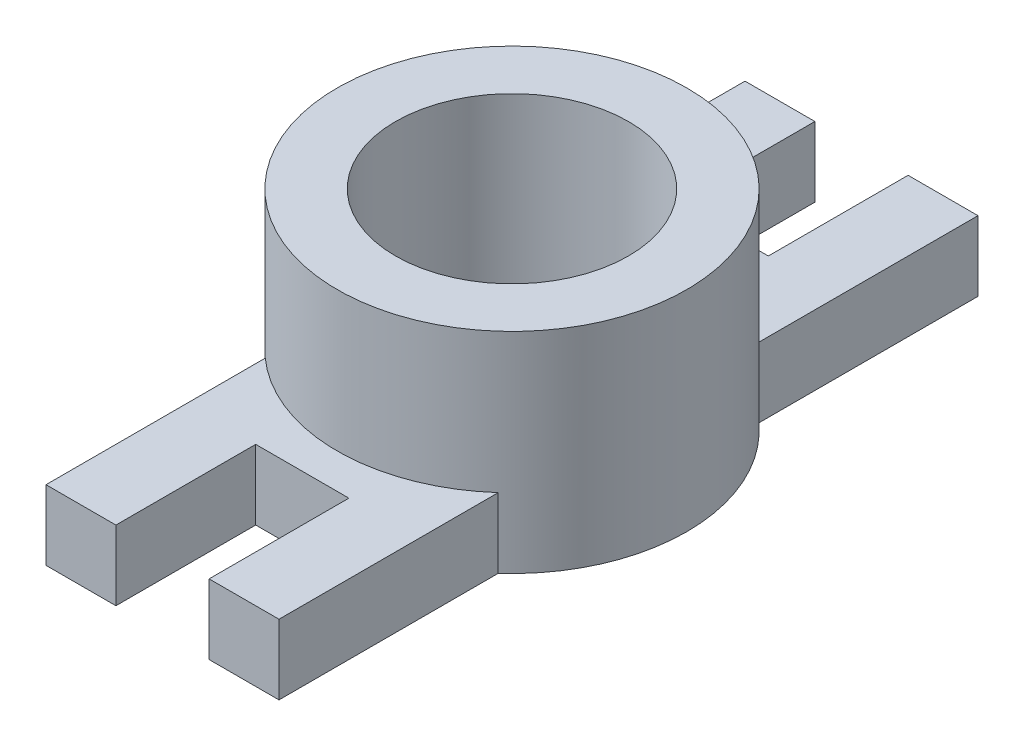
ISO-10303-21;
HEADER;
FILE_DESCRIPTION(('STEP AP214'),'2;1');
FILE_NAME('part.step','',(''),(''),'','','');
FILE_SCHEMA(('AUTOMOTIVE_DESIGN { 1 0 10303 214 1 1 1 1 }'));
ENDSEC;
DATA;
#1=APPLICATION_CONTEXT('core data for automotive mechanical design processes');
#2=APPLICATION_PROTOCOL_DEFINITION('international standard','automotive_design',2000,#1);
#3=PRODUCT_CONTEXT('',#1,'mechanical');
#4=PRODUCT('Part','Part','',(#3));
#5=PRODUCT_RELATED_PRODUCT_CATEGORY('part','',(#4));
#6=PRODUCT_DEFINITION_FORMATION('','',#4);
#7=PRODUCT_DEFINITION_CONTEXT('part definition',#1,'design');
#8=PRODUCT_DEFINITION('design','',#6,#7);
#9=PRODUCT_DEFINITION_SHAPE('','',#8);
#10=(LENGTH_UNIT() NAMED_UNIT(*) SI_UNIT(.MILLI.,.METRE.));
#11=(NAMED_UNIT(*) PLANE_ANGLE_UNIT() SI_UNIT($,.RADIAN.));
#12=(NAMED_UNIT(*) SI_UNIT($,.STERADIAN.) SOLID_ANGLE_UNIT());
#13=UNCERTAINTY_MEASURE_WITH_UNIT(LENGTH_MEASURE(1.E-05),#10,'distance_accuracy_value','');
#14=(GEOMETRIC_REPRESENTATION_CONTEXT(3) GLOBAL_UNCERTAINTY_ASSIGNED_CONTEXT((#13)) GLOBAL_UNIT_ASSIGNED_CONTEXT((#10,
#11,#12)) REPRESENTATION_CONTEXT('',''));
#15=CARTESIAN_POINT('',(0.,0.,0.));
#16=DIRECTION('',(0.,0.,1.));
#17=DIRECTION('',(1.,0.,0.));
#18=AXIS2_PLACEMENT_3D('',#15,#16,#17);
#19=CARTESIAN_POINT('',(-25.,15.,-75.));
#20=DIRECTION('',(1.,0.,0.));
#21=DIRECTION('',(0.,0.,-1.));
#22=AXIS2_PLACEMENT_3D('',#19,#20,#21);
#23=PLANE('',#22);
#24=DIRECTION('',(0.,0.,1.));
#25=VECTOR('',#24,1.);
#26=CARTESIAN_POINT('',(-25.,0.,-75.));
#27=LINE('',#26,#25);
#28=CARTESIAN_POINT('',(-25.,0.,-75.));
#29=VERTEX_POINT('',#28);
#30=CARTESIAN_POINT('',(-25.,0.,-27.9508497187474));
#31=VERTEX_POINT('',#30);
#32=EDGE_CURVE('E172',#29,#31,#27,.T.);
#33=ORIENTED_EDGE('',*,*,#32,.T.);
#34=DIRECTION('',(0.,-1.,0.));
#35=VECTOR('',#34,1.);
#36=CARTESIAN_POINT('',(-25.,45.,-27.9508497187474));
#37=LINE('',#36,#35);
#38=CARTESIAN_POINT('',(-25.,15.,-27.9508497187474));
#39=VERTEX_POINT('',#38);
#40=EDGE_CURVE('E307',#31,#39,#37,.F.);
#41=ORIENTED_EDGE('',*,*,#40,.T.);
#42=DIRECTION('',(0.,0.,1.));
#43=VECTOR('',#42,1.);
#44=CARTESIAN_POINT('',(-25.,15.,-75.));
#45=LINE('',#44,#43);
#46=CARTESIAN_POINT('',(-25.,15.,-75.));
#47=VERTEX_POINT('',#46);
#48=EDGE_CURVE('E111',#47,#39,#45,.T.);
#49=ORIENTED_EDGE('',*,*,#48,.F.);
#50=DIRECTION('',(0.,-1.,0.));
#51=VECTOR('',#50,1.);
#52=CARTESIAN_POINT('',(-25.,15.,-75.));
#53=LINE('',#52,#51);
#54=EDGE_CURVE('E11',#47,#29,#53,.T.);
#55=ORIENTED_EDGE('',*,*,#54,.T.);
#56=EDGE_LOOP('',(#33,#41,#49,#55));
#57=FACE_BOUND('',#56,.T.);
#58=ADVANCED_FACE('F33',(#57),#23,.F.);
#59=CARTESIAN_POINT('',(25.,15.,-75.));
#60=DIRECTION('',(-1.,0.,0.));
#61=DIRECTION('',(0.,0.,1.));
#62=AXIS2_PLACEMENT_3D('',#59,#60,#61);
#63=PLANE('',#62);
#64=DIRECTION('',(0.,0.,-1.));
#65=VECTOR('',#64,1.);
#66=CARTESIAN_POINT('',(25.,0.,-75.));
#67=LINE('',#66,#65);
#68=CARTESIAN_POINT('',(25.,0.,75.));
#69=VERTEX_POINT('',#68);
#70=CARTESIAN_POINT('',(25.,0.,27.9508497187474));
#71=VERTEX_POINT('',#70);
#72=EDGE_CURVE('E186',#69,#71,#67,.T.);
#73=ORIENTED_EDGE('',*,*,#72,.T.);
#74=DIRECTION('',(0.,-1.,0.));
#75=VECTOR('',#74,1.);
#76=CARTESIAN_POINT('',(25.,45.,27.9508497187474));
#77=LINE('',#76,#75);
#78=CARTESIAN_POINT('',(25.,15.,27.9508497187474));
#79=VERTEX_POINT('',#78);
#80=EDGE_CURVE('E302',#71,#79,#77,.F.);
#81=ORIENTED_EDGE('',*,*,#80,.T.);
#82=DIRECTION('',(0.,0.,-1.));
#83=VECTOR('',#82,1.);
#84=CARTESIAN_POINT('',(25.,15.,-75.));
#85=LINE('',#84,#83);
#86=CARTESIAN_POINT('',(25.,15.,75.));
#87=VERTEX_POINT('',#86);
#88=EDGE_CURVE('E256',#87,#79,#85,.T.);
#89=ORIENTED_EDGE('',*,*,#88,.F.);
#90=DIRECTION('',(0.,-1.,0.));
#91=VECTOR('',#90,1.);
#92=CARTESIAN_POINT('',(25.,15.,75.));
#93=LINE('',#92,#91);
#94=EDGE_CURVE('E202',#87,#69,#93,.T.);
#95=ORIENTED_EDGE('',*,*,#94,.T.);
#96=EDGE_LOOP('',(#73,#81,#89,#95));
#97=FACE_BOUND('',#96,.T.);
#98=ADVANCED_FACE('F312',(#97),#63,.F.);
#99=CARTESIAN_POINT('',(0.,15.,0.));
#100=DIRECTION('',(0.,-1.,0.));
#101=DIRECTION('',(0.,0.,-1.));
#102=AXIS2_PLACEMENT_3D('',#99,#100,#101);
#103=PLANE('',#102);
#104=ORIENTED_EDGE('',*,*,#88,.T.);
#105=CARTESIAN_POINT('',(0.,15.,0.));
#106=DIRECTION('',(0.,-1.,0.));
#107=DIRECTION('',(0.,0.,-1.));
#108=AXIS2_PLACEMENT_3D('',#105,#106,#107);
#109=CIRCLE('',#108,37.5);
#110=CARTESIAN_POINT('',(-25.,15.,27.9508497187474));
#111=VERTEX_POINT('',#110);
#112=EDGE_CURVE('E282',#79,#111,#109,.T.);
#113=ORIENTED_EDGE('',*,*,#112,.T.);
#114=CARTESIAN_POINT('',(-25.,15.,75.));
#115=VERTEX_POINT('',#114);
#116=EDGE_CURVE('E275',#111,#115,#45,.T.);
#117=ORIENTED_EDGE('',*,*,#116,.T.);
#118=DIRECTION('',(1.,0.,0.));
#119=VECTOR('',#118,1.);
#120=CARTESIAN_POINT('',(-25.,15.,75.));
#121=LINE('',#120,#119);
#122=CARTESIAN_POINT('',(-10.,15.,75.));
#123=VERTEX_POINT('',#122);
#124=EDGE_CURVE('E224',#115,#123,#121,.T.);
#125=ORIENTED_EDGE('',*,*,#124,.T.);
#126=DIRECTION('',(0.,0.,-1.));
#127=VECTOR('',#126,1.);
#128=CARTESIAN_POINT('',(-10.,15.,75.));
#129=LINE('',#128,#127);
#130=CARTESIAN_POINT('',(-10.,15.,45.));
#131=VERTEX_POINT('',#130);
#132=EDGE_CURVE('E247',#123,#131,#129,.T.);
#133=ORIENTED_EDGE('',*,*,#132,.T.);
#134=DIRECTION('',(1.,0.,0.));
#135=VECTOR('',#134,1.);
#136=CARTESIAN_POINT('',(-10.,15.,45.));
#137=LINE('',#136,#135);
#138=CARTESIAN_POINT('',(9.99999999999999,15.,45.));
#139=VERTEX_POINT('',#138);
#140=EDGE_CURVE('E243',#131,#139,#137,.T.);
#141=ORIENTED_EDGE('',*,*,#140,.T.);
#142=DIRECTION('',(0.,0.,1.));
#143=VECTOR('',#142,1.);
#144=CARTESIAN_POINT('',(9.99999999999999,15.,45.));
#145=LINE('',#144,#143);
#146=CARTESIAN_POINT('',(9.99999999999999,15.,75.));
#147=VERTEX_POINT('',#146);
#148=EDGE_CURVE('E246',#139,#147,#145,.T.);
#149=ORIENTED_EDGE('',*,*,#148,.T.);
#150=DIRECTION('',(1.,0.,0.));
#151=VECTOR('',#150,1.);
#152=CARTESIAN_POINT('',(9.99999999999999,15.,75.));
#153=LINE('',#152,#151);
#154=EDGE_CURVE('E249',#147,#87,#153,.T.);
#155=ORIENTED_EDGE('',*,*,#154,.T.);
#156=EDGE_LOOP('',(#104,#113,#117,#125,#133,#141,#149,#155));
#157=FACE_BOUND('',#156,.T.);
#158=ADVANCED_FACE('F280',(#157),#103,.F.);
#159=CARTESIAN_POINT('',(-25.,15.,-75.));
#160=DIRECTION('',(0.,0.,1.));
#161=DIRECTION('',(1.,0.,0.));
#162=AXIS2_PLACEMENT_3D('',#159,#160,#161);
#163=PLANE('',#162);
#164=DIRECTION('',(-1.,0.,0.));
#165=VECTOR('',#164,1.);
#166=CARTESIAN_POINT('',(-25.,0.,-75.));
#167=LINE('',#166,#165);
#168=CARTESIAN_POINT('',(-10.,0.,-75.));
#169=VERTEX_POINT('',#168);
#170=EDGE_CURVE('E167',#169,#29,#167,.T.);
#171=ORIENTED_EDGE('',*,*,#170,.T.);
#172=ORIENTED_EDGE('',*,*,#54,.F.);
#173=DIRECTION('',(-1.,0.,0.));
#174=VECTOR('',#173,1.);
#175=CARTESIAN_POINT('',(-25.,15.,-75.));
#176=LINE('',#175,#174);
#177=CARTESIAN_POINT('',(-10.,15.,-75.));
#178=VERTEX_POINT('',#177);
#179=EDGE_CURVE('E195',#178,#47,#176,.T.);
#180=ORIENTED_EDGE('',*,*,#179,.F.);
#181=DIRECTION('',(0.,-1.,0.));
#182=VECTOR('',#181,1.);
#183=CARTESIAN_POINT('',(-10.,15.,-75.));
#184=LINE('',#183,#182);
#185=EDGE_CURVE('E163',#178,#169,#184,.T.);
#186=ORIENTED_EDGE('',*,*,#185,.T.);
#187=EDGE_LOOP('',(#171,#172,#180,#186));
#188=FACE_BOUND('',#187,.T.);
#189=ADVANCED_FACE('F35',(#188),#163,.F.);
#190=ORIENTED_EDGE('',*,*,#116,.F.);
#191=DIRECTION('',(0.,-1.,0.));
#192=VECTOR('',#191,1.);
#193=CARTESIAN_POINT('',(-25.,45.,27.9508497187474));
#194=LINE('',#193,#192);
#195=CARTESIAN_POINT('',(-25.,0.,27.9508497187474));
#196=VERTEX_POINT('',#195);
#197=EDGE_CURVE('E171',#111,#196,#194,.T.);
#198=ORIENTED_EDGE('',*,*,#197,.T.);
#199=CARTESIAN_POINT('',(-25.,0.,75.));
#200=VERTEX_POINT('',#199);
#201=EDGE_CURVE('E170',#196,#200,#27,.T.);
#202=ORIENTED_EDGE('',*,*,#201,.T.);
#203=DIRECTION('',(0.,-1.,0.));
#204=VECTOR('',#203,1.);
#205=CARTESIAN_POINT('',(-25.,15.,75.));
#206=LINE('',#205,#204);
#207=EDGE_CURVE('E42',#115,#200,#206,.T.);
#208=ORIENTED_EDGE('',*,*,#207,.F.);
#209=EDGE_LOOP('',(#190,#198,#202,#208));
#210=FACE_BOUND('',#209,.T.);
#211=ADVANCED_FACE('F284',(#210),#23,.F.);
#212=CARTESIAN_POINT('',(-25.,15.,75.));
#213=DIRECTION('',(0.,0.,-1.));
#214=DIRECTION('',(-1.,0.,0.));
#215=AXIS2_PLACEMENT_3D('',#212,#213,#214);
#216=PLANE('',#215);
#217=DIRECTION('',(1.,0.,0.));
#218=VECTOR('',#217,1.);
#219=CARTESIAN_POINT('',(-25.,0.,75.));
#220=LINE('',#219,#218);
#221=CARTESIAN_POINT('',(-10.,0.,75.));
#222=VERTEX_POINT('',#221);
#223=EDGE_CURVE('E175',#200,#222,#220,.T.);
#224=ORIENTED_EDGE('',*,*,#223,.T.);
#225=DIRECTION('',(0.,-1.,0.));
#226=VECTOR('',#225,1.);
#227=CARTESIAN_POINT('',(-10.,15.,75.));
#228=LINE('',#227,#226);
#229=EDGE_CURVE('E214',#123,#222,#228,.T.);
#230=ORIENTED_EDGE('',*,*,#229,.F.);
#231=ORIENTED_EDGE('',*,*,#124,.F.);
#232=ORIENTED_EDGE('',*,*,#207,.T.);
#233=EDGE_LOOP('',(#224,#230,#231,#232));
#234=FACE_BOUND('',#233,.T.);
#235=ADVANCED_FACE('F222',(#234),#216,.F.);
#236=CARTESIAN_POINT('',(-10.,15.,75.));
#237=DIRECTION('',(-1.,0.,0.));
#238=DIRECTION('',(0.,0.,1.));
#239=AXIS2_PLACEMENT_3D('',#236,#237,#238);
#240=PLANE('',#239);
#241=DIRECTION('',(0.,0.,-1.));
#242=VECTOR('',#241,1.);
#243=CARTESIAN_POINT('',(-10.,0.,75.));
#244=LINE('',#243,#242);
#245=CARTESIAN_POINT('',(-10.,0.,45.));
#246=VERTEX_POINT('',#245);
#247=EDGE_CURVE('E177',#222,#246,#244,.T.);
#248=ORIENTED_EDGE('',*,*,#247,.T.);
#249=DIRECTION('',(0.,-1.,0.));
#250=VECTOR('',#249,1.);
#251=CARTESIAN_POINT('',(-10.,15.,45.));
#252=LINE('',#251,#250);
#253=EDGE_CURVE('E211',#131,#246,#252,.T.);
#254=ORIENTED_EDGE('',*,*,#253,.F.);
#255=ORIENTED_EDGE('',*,*,#132,.F.);
#256=ORIENTED_EDGE('',*,*,#229,.T.);
#257=EDGE_LOOP('',(#248,#254,#255,#256));
#258=FACE_BOUND('',#257,.T.);
#259=ADVANCED_FACE('F237',(#258),#240,.F.);
#260=CARTESIAN_POINT('',(-10.,15.,45.));
#261=DIRECTION('',(0.,0.,-1.));
#262=DIRECTION('',(-1.,0.,0.));
#263=AXIS2_PLACEMENT_3D('',#260,#261,#262);
#264=PLANE('',#263);
#265=DIRECTION('',(1.,0.,0.));
#266=VECTOR('',#265,1.);
#267=CARTESIAN_POINT('',(-10.,0.,45.));
#268=LINE('',#267,#266);
#269=CARTESIAN_POINT('',(9.99999999999999,0.,45.));
#270=VERTEX_POINT('',#269);
#271=EDGE_CURVE('E179',#246,#270,#268,.T.);
#272=ORIENTED_EDGE('',*,*,#271,.T.);
#273=DIRECTION('',(0.,-1.,0.));
#274=VECTOR('',#273,1.);
#275=CARTESIAN_POINT('',(9.99999999999999,15.,45.));
#276=LINE('',#275,#274);
#277=EDGE_CURVE('E208',#139,#270,#276,.T.);
#278=ORIENTED_EDGE('',*,*,#277,.F.);
#279=ORIENTED_EDGE('',*,*,#140,.F.);
#280=ORIENTED_EDGE('',*,*,#253,.T.);
#281=EDGE_LOOP('',(#272,#278,#279,#280));
#282=FACE_BOUND('',#281,.T.);
#283=ADVANCED_FACE('F241',(#282),#264,.F.);
#284=CARTESIAN_POINT('',(9.99999999999999,15.,45.));
#285=DIRECTION('',(1.,0.,0.));
#286=DIRECTION('',(0.,0.,-1.));
#287=AXIS2_PLACEMENT_3D('',#284,#285,#286);
#288=PLANE('',#287);
#289=DIRECTION('',(0.,0.,1.));
#290=VECTOR('',#289,1.);
#291=CARTESIAN_POINT('',(9.99999999999999,0.,45.));
#292=LINE('',#291,#290);
#293=CARTESIAN_POINT('',(9.99999999999999,0.,75.));
#294=VERTEX_POINT('',#293);
#295=EDGE_CURVE('E181',#270,#294,#292,.T.);
#296=ORIENTED_EDGE('',*,*,#295,.T.);
#297=DIRECTION('',(0.,-1.,0.));
#298=VECTOR('',#297,1.);
#299=CARTESIAN_POINT('',(9.99999999999999,15.,75.));
#300=LINE('',#299,#298);
#301=EDGE_CURVE('E205',#147,#294,#300,.T.);
#302=ORIENTED_EDGE('',*,*,#301,.F.);
#303=ORIENTED_EDGE('',*,*,#148,.F.);
#304=ORIENTED_EDGE('',*,*,#277,.T.);
#305=EDGE_LOOP('',(#296,#302,#303,#304));
#306=FACE_BOUND('',#305,.T.);
#307=ADVANCED_FACE('F320',(#306),#288,.F.);
#308=CARTESIAN_POINT('',(9.99999999999999,15.,75.));
#309=DIRECTION('',(0.,0.,-1.));
#310=DIRECTION('',(-1.,0.,0.));
#311=AXIS2_PLACEMENT_3D('',#308,#309,#310);
#312=PLANE('',#311);
#313=DIRECTION('',(1.,0.,0.));
#314=VECTOR('',#313,1.);
#315=CARTESIAN_POINT('',(9.99999999999999,0.,75.));
#316=LINE('',#315,#314);
#317=EDGE_CURVE('E183',#294,#69,#316,.T.);
#318=ORIENTED_EDGE('',*,*,#317,.T.);
#319=ORIENTED_EDGE('',*,*,#94,.F.);
#320=ORIENTED_EDGE('',*,*,#154,.F.);
#321=ORIENTED_EDGE('',*,*,#301,.T.);
#322=EDGE_LOOP('',(#318,#319,#320,#321));
#323=FACE_BOUND('',#322,.T.);
#324=ADVANCED_FACE('F316',(#323),#312,.F.);
#325=CARTESIAN_POINT('',(25.,15.,-27.9508497187474));
#326=VERTEX_POINT('',#325);
#327=CARTESIAN_POINT('',(25.,15.,-75.));
#328=VERTEX_POINT('',#327);
#329=EDGE_CURVE('E255',#326,#328,#85,.T.);
#330=ORIENTED_EDGE('',*,*,#329,.F.);
#331=DIRECTION('',(0.,-1.,0.));
#332=VECTOR('',#331,1.);
#333=CARTESIAN_POINT('',(25.,45.,-27.9508497187474));
#334=LINE('',#333,#332);
#335=CARTESIAN_POINT('',(25.,0.,-27.9508497187474));
#336=VERTEX_POINT('',#335);
#337=EDGE_CURVE('E49',#326,#336,#334,.T.);
#338=ORIENTED_EDGE('',*,*,#337,.T.);
#339=CARTESIAN_POINT('',(25.,0.,-75.));
#340=VERTEX_POINT('',#339);
#341=EDGE_CURVE('E185',#336,#340,#67,.T.);
#342=ORIENTED_EDGE('',*,*,#341,.T.);
#343=DIRECTION('',(0.,-1.,0.));
#344=VECTOR('',#343,1.);
#345=CARTESIAN_POINT('',(25.,15.,-75.));
#346=LINE('',#345,#344);
#347=EDGE_CURVE('E199',#328,#340,#346,.T.);
#348=ORIENTED_EDGE('',*,*,#347,.F.);
#349=EDGE_LOOP('',(#330,#338,#342,#348));
#350=FACE_BOUND('',#349,.T.);
#351=ADVANCED_FACE('F265',(#350),#63,.F.);
#352=CARTESIAN_POINT('',(9.99999999999999,15.,-75.));
#353=DIRECTION('',(0.,0.,1.));
#354=DIRECTION('',(1.,0.,0.));
#355=AXIS2_PLACEMENT_3D('',#352,#353,#354);
#356=PLANE('',#355);
#357=DIRECTION('',(-1.,0.,0.));
#358=VECTOR('',#357,1.);
#359=CARTESIAN_POINT('',(9.99999999999999,0.,-75.));
#360=LINE('',#359,#358);
#361=CARTESIAN_POINT('',(9.99999999999999,0.,-75.));
#362=VERTEX_POINT('',#361);
#363=EDGE_CURVE('E189',#340,#362,#360,.T.);
#364=ORIENTED_EDGE('',*,*,#363,.T.);
#365=DIRECTION('',(0.,-1.,0.));
#366=VECTOR('',#365,1.);
#367=CARTESIAN_POINT('',(9.99999999999999,15.,-75.));
#368=LINE('',#367,#366);
#369=CARTESIAN_POINT('',(9.99999999999999,15.,-75.));
#370=VERTEX_POINT('',#369);
#371=EDGE_CURVE('E158',#370,#362,#368,.T.);
#372=ORIENTED_EDGE('',*,*,#371,.F.);
#373=DIRECTION('',(-1.,0.,0.));
#374=VECTOR('',#373,1.);
#375=CARTESIAN_POINT('',(9.99999999999999,15.,-75.));
#376=LINE('',#375,#374);
#377=EDGE_CURVE('E146',#328,#370,#376,.T.);
#378=ORIENTED_EDGE('',*,*,#377,.F.);
#379=ORIENTED_EDGE('',*,*,#347,.T.);
#380=EDGE_LOOP('',(#364,#372,#378,#379));
#381=FACE_BOUND('',#380,.T.);
#382=ADVANCED_FACE('F269',(#381),#356,.F.);
#383=CARTESIAN_POINT('',(9.99999999999999,15.,-45.));
#384=DIRECTION('',(1.,0.,0.));
#385=DIRECTION('',(0.,0.,-1.));
#386=AXIS2_PLACEMENT_3D('',#383,#384,#385);
#387=PLANE('',#386);
#388=DIRECTION('',(0.,0.,1.));
#389=VECTOR('',#388,1.);
#390=CARTESIAN_POINT('',(9.99999999999999,0.,-45.));
#391=LINE('',#390,#389);
#392=CARTESIAN_POINT('',(9.99999999999999,0.,-45.));
#393=VERTEX_POINT('',#392);
#394=EDGE_CURVE('E155',#362,#393,#391,.T.);
#395=ORIENTED_EDGE('',*,*,#394,.T.);
#396=DIRECTION('',(0.,-1.,0.));
#397=VECTOR('',#396,1.);
#398=CARTESIAN_POINT('',(9.99999999999999,15.,-45.));
#399=LINE('',#398,#397);
#400=CARTESIAN_POINT('',(9.99999999999999,15.,-45.));
#401=VERTEX_POINT('',#400);
#402=EDGE_CURVE('E152',#401,#393,#399,.T.);
#403=ORIENTED_EDGE('',*,*,#402,.F.);
#404=DIRECTION('',(0.,0.,1.));
#405=VECTOR('',#404,1.);
#406=CARTESIAN_POINT('',(9.99999999999999,15.,-45.));
#407=LINE('',#406,#405);
#408=EDGE_CURVE('E139',#370,#401,#407,.T.);
#409=ORIENTED_EDGE('',*,*,#408,.F.);
#410=ORIENTED_EDGE('',*,*,#371,.T.);
#411=EDGE_LOOP('',(#395,#403,#409,#410));
#412=FACE_BOUND('',#411,.T.);
#413=ADVANCED_FACE('F153',(#412),#387,.F.);
#414=CARTESIAN_POINT('',(-10.,15.,-45.));
#415=DIRECTION('',(0.,0.,1.));
#416=DIRECTION('',(1.,0.,0.));
#417=AXIS2_PLACEMENT_3D('',#414,#415,#416);
#418=PLANE('',#417);
#419=DIRECTION('',(-1.,0.,0.));
#420=VECTOR('',#419,1.);
#421=CARTESIAN_POINT('',(-10.,0.,-45.));
#422=LINE('',#421,#420);
#423=CARTESIAN_POINT('',(-10.,0.,-45.));
#424=VERTEX_POINT('',#423);
#425=EDGE_CURVE('E192',#393,#424,#422,.T.);
#426=ORIENTED_EDGE('',*,*,#425,.T.);
#427=DIRECTION('',(0.,-1.,0.));
#428=VECTOR('',#427,1.);
#429=CARTESIAN_POINT('',(-10.,15.,-45.));
#430=LINE('',#429,#428);
#431=CARTESIAN_POINT('',(-10.,15.,-45.));
#432=VERTEX_POINT('',#431);
#433=EDGE_CURVE('E159',#432,#424,#430,.T.);
#434=ORIENTED_EDGE('',*,*,#433,.F.);
#435=DIRECTION('',(-1.,0.,0.));
#436=VECTOR('',#435,1.);
#437=CARTESIAN_POINT('',(-10.,15.,-45.));
#438=LINE('',#437,#436);
#439=EDGE_CURVE('E143',#401,#432,#438,.T.);
#440=ORIENTED_EDGE('',*,*,#439,.F.);
#441=ORIENTED_EDGE('',*,*,#402,.T.);
#442=EDGE_LOOP('',(#426,#434,#440,#441));
#443=FACE_BOUND('',#442,.T.);
#444=ADVANCED_FACE('F161',(#443),#418,.F.);
#445=CARTESIAN_POINT('',(-10.,15.,-75.));
#446=DIRECTION('',(-1.,0.,0.));
#447=DIRECTION('',(0.,0.,1.));
#448=AXIS2_PLACEMENT_3D('',#445,#446,#447);
#449=PLANE('',#448);
#450=DIRECTION('',(0.,0.,-1.));
#451=VECTOR('',#450,1.);
#452=CARTESIAN_POINT('',(-10.,0.,-75.));
#453=LINE('',#452,#451);
#454=EDGE_CURVE('E103',#424,#169,#453,.T.);
#455=ORIENTED_EDGE('',*,*,#454,.T.);
#456=ORIENTED_EDGE('',*,*,#185,.F.);
#457=DIRECTION('',(0.,0.,-1.));
#458=VECTOR('',#457,1.);
#459=CARTESIAN_POINT('',(-10.,15.,-75.));
#460=LINE('',#459,#458);
#461=EDGE_CURVE('E58',#432,#178,#460,.T.);
#462=ORIENTED_EDGE('',*,*,#461,.F.);
#463=ORIENTED_EDGE('',*,*,#433,.T.);
#464=EDGE_LOOP('',(#455,#456,#462,#463));
#465=FACE_BOUND('',#464,.T.);
#466=ADVANCED_FACE('F271',(#465),#449,.F.);
#467=ORIENTED_EDGE('',*,*,#48,.T.);
#468=EDGE_CURVE('E263',#39,#326,#109,.T.);
#469=ORIENTED_EDGE('',*,*,#468,.T.);
#470=ORIENTED_EDGE('',*,*,#329,.T.);
#471=ORIENTED_EDGE('',*,*,#377,.T.);
#472=ORIENTED_EDGE('',*,*,#408,.T.);
#473=ORIENTED_EDGE('',*,*,#439,.T.);
#474=ORIENTED_EDGE('',*,*,#461,.T.);
#475=ORIENTED_EDGE('',*,*,#179,.T.);
#476=EDGE_LOOP('',(#467,#469,#470,#471,#472,#473,#474,#475));
#477=FACE_BOUND('',#476,.T.);
#478=ADVANCED_FACE('F141',(#477),#103,.F.);
#479=CARTESIAN_POINT('',(0.,0.,0.));
#480=DIRECTION('',(0.,-1.,0.));
#481=DIRECTION('',(0.,0.,-1.));
#482=AXIS2_PLACEMENT_3D('',#479,#480,#481);
#483=PLANE('',#482);
#484=CARTESIAN_POINT('',(0.,0.,0.));
#485=DIRECTION('',(0.,-1.,0.));
#486=DIRECTION('',(0.,0.,-1.));
#487=AXIS2_PLACEMENT_3D('',#484,#485,#486);
#488=CIRCLE('',#487,25.);
#489=CARTESIAN_POINT('',(0.,0.,-25.));
#490=VERTEX_POINT('',#489);
#491=EDGE_CURVE('E37',#490,#490,#488,.T.);
#492=ORIENTED_EDGE('',*,*,#491,.F.);
#493=EDGE_LOOP('',(#492));
#494=FACE_BOUND('',#493,.T.);
#495=ORIENTED_EDGE('',*,*,#201,.F.);
#496=CARTESIAN_POINT('',(0.,0.,0.));
#497=DIRECTION('',(0.,-1.,0.));
#498=DIRECTION('',(0.,0.,-1.));
#499=AXIS2_PLACEMENT_3D('',#496,#497,#498);
#500=CIRCLE('',#499,37.5);
#501=EDGE_CURVE('E305',#196,#31,#500,.T.);
#502=ORIENTED_EDGE('',*,*,#501,.T.);
#503=ORIENTED_EDGE('',*,*,#32,.F.);
#504=ORIENTED_EDGE('',*,*,#170,.F.);
#505=ORIENTED_EDGE('',*,*,#454,.F.);
#506=ORIENTED_EDGE('',*,*,#425,.F.);
#507=ORIENTED_EDGE('',*,*,#394,.F.);
#508=ORIENTED_EDGE('',*,*,#363,.F.);
#509=ORIENTED_EDGE('',*,*,#341,.F.);
#510=EDGE_CURVE('E300',#336,#71,#500,.T.);
#511=ORIENTED_EDGE('',*,*,#510,.T.);
#512=ORIENTED_EDGE('',*,*,#72,.F.);
#513=ORIENTED_EDGE('',*,*,#317,.F.);
#514=ORIENTED_EDGE('',*,*,#295,.F.);
#515=ORIENTED_EDGE('',*,*,#271,.F.);
#516=ORIENTED_EDGE('',*,*,#247,.F.);
#517=ORIENTED_EDGE('',*,*,#223,.F.);
#518=EDGE_LOOP('',(#495,#502,#503,#504,#505,#506,#507,#508,#509,#511,#512,#513,#514,#515,#516,#517));
#519=FACE_BOUND('',#518,.T.);
#520=ADVANCED_FACE('F230',(#494,#519),#483,.T.);
#521=CARTESIAN_POINT('',(0.,45.,0.));
#522=DIRECTION('',(0.,-1.,0.));
#523=DIRECTION('',(0.,0.,-1.));
#524=AXIS2_PLACEMENT_3D('',#521,#522,#523);
#525=CYLINDRICAL_SURFACE('',#524,37.5);
#526=CARTESIAN_POINT('',(0.,45.,0.));
#527=DIRECTION('',(0.,-1.,0.));
#528=DIRECTION('',(0.,0.,-1.));
#529=AXIS2_PLACEMENT_3D('',#526,#527,#528);
#530=CIRCLE('',#529,37.5);
#531=CARTESIAN_POINT('',(0.,45.,-37.5));
#532=VERTEX_POINT('',#531);
#533=EDGE_CURVE('E304',#532,#532,#530,.T.);
#534=ORIENTED_EDGE('',*,*,#533,.T.);
#535=EDGE_LOOP('',(#534));
#536=FACE_BOUND('',#535,.T.);
#537=ORIENTED_EDGE('',*,*,#197,.F.);
#538=ORIENTED_EDGE('',*,*,#112,.F.);
#539=ORIENTED_EDGE('',*,*,#80,.F.);
#540=ORIENTED_EDGE('',*,*,#510,.F.);
#541=ORIENTED_EDGE('',*,*,#337,.F.);
#542=ORIENTED_EDGE('',*,*,#468,.F.);
#543=ORIENTED_EDGE('',*,*,#40,.F.);
#544=ORIENTED_EDGE('',*,*,#501,.F.);
#545=EDGE_LOOP('',(#537,#538,#539,#540,#541,#542,#543,#544));
#546=FACE_BOUND('',#545,.T.);
#547=ADVANCED_FACE('F301',(#536,#546),#525,.T.);
#548=CARTESIAN_POINT('',(0.,45.,0.));
#549=DIRECTION('',(0.,-1.,0.));
#550=DIRECTION('',(0.,0.,-1.));
#551=AXIS2_PLACEMENT_3D('',#548,#549,#550);
#552=CYLINDRICAL_SURFACE('',#551,25.);
#553=CARTESIAN_POINT('',(0.,45.,0.));
#554=DIRECTION('',(0.,-1.,0.));
#555=DIRECTION('',(0.,0.,-1.));
#556=AXIS2_PLACEMENT_3D('',#553,#554,#555);
#557=CIRCLE('',#556,25.);
#558=CARTESIAN_POINT('',(0.,45.,-25.));
#559=VERTEX_POINT('',#558);
#560=EDGE_CURVE('E491',#559,#559,#557,.T.);
#561=CARTESIAN_POINT('',(0.,45.,-25.));
#562=CARTESIAN_POINT('',(0.,44.53125,-25.));
#563=CARTESIAN_POINT('',(0.,44.0625,-25.));
#564=CARTESIAN_POINT('',(0.,43.125,-25.));
#565=CARTESIAN_POINT('',(0.,42.65625,-25.));
#566=CARTESIAN_POINT('',(0.,41.71875,-25.));
#567=CARTESIAN_POINT('',(0.,41.25,-25.));
#568=CARTESIAN_POINT('',(0.,40.3125,-25.));
#569=CARTESIAN_POINT('',(0.,39.84375,-25.));
#570=CARTESIAN_POINT('',(0.,38.90625,-25.));
#571=CARTESIAN_POINT('',(0.,38.4375,-25.));
#572=CARTESIAN_POINT('',(0.,37.5,-25.));
#573=CARTESIAN_POINT('',(0.,37.03125,-25.));
#574=CARTESIAN_POINT('',(0.,36.09375,-25.));
#575=CARTESIAN_POINT('',(0.,35.625,-25.));
#576=CARTESIAN_POINT('',(0.,34.6875,-25.));
#577=CARTESIAN_POINT('',(0.,34.21875,-25.));
#578=CARTESIAN_POINT('',(0.,33.28125,-25.));
#579=CARTESIAN_POINT('',(0.,32.8125,-25.));
#580=CARTESIAN_POINT('',(0.,31.875,-25.));
#581=CARTESIAN_POINT('',(0.,31.40625,-25.));
#582=CARTESIAN_POINT('',(0.,30.46875,-25.));
#583=CARTESIAN_POINT('',(0.,30.,-25.));
#584=CARTESIAN_POINT('',(0.,29.0625,-25.));
#585=CARTESIAN_POINT('',(0.,28.59375,-25.));
#586=CARTESIAN_POINT('',(0.,27.65625,-25.));
#587=CARTESIAN_POINT('',(0.,27.1875,-25.));
#588=CARTESIAN_POINT('',(0.,26.25,-25.));
#589=CARTESIAN_POINT('',(0.,25.78125,-25.));
#590=CARTESIAN_POINT('',(0.,24.84375,-25.));
#591=CARTESIAN_POINT('',(0.,24.375,-25.));
#592=CARTESIAN_POINT('',(0.,23.4375,-25.));
#593=CARTESIAN_POINT('',(0.,22.96875,-25.));
#594=CARTESIAN_POINT('',(0.,22.03125,-25.));
#595=CARTESIAN_POINT('',(0.,21.5625,-25.));
#596=CARTESIAN_POINT('',(0.,20.625,-25.));
#597=CARTESIAN_POINT('',(0.,20.15625,-25.));
#598=CARTESIAN_POINT('',(0.,19.21875,-25.));
#599=CARTESIAN_POINT('',(0.,18.75,-25.));
#600=CARTESIAN_POINT('',(0.,17.8125,-25.));
#601=CARTESIAN_POINT('',(0.,17.34375,-25.));
#602=CARTESIAN_POINT('',(0.,16.40625,-25.));
#603=CARTESIAN_POINT('',(0.,15.9375,-25.));
#604=CARTESIAN_POINT('',(0.,15.,-25.));
#605=CARTESIAN_POINT('',(0.,14.53125,-25.));
#606=CARTESIAN_POINT('',(0.,13.59375,-25.));
#607=CARTESIAN_POINT('',(0.,13.125,-25.));
#608=CARTESIAN_POINT('',(0.,12.1875,-25.));
#609=CARTESIAN_POINT('',(0.,11.71875,-25.));
#610=CARTESIAN_POINT('',(0.,10.78125,-25.));
#611=CARTESIAN_POINT('',(0.,10.3125,-25.));
#612=CARTESIAN_POINT('',(0.,9.37500000000001,-25.));
#613=CARTESIAN_POINT('',(0.,8.90625000000001,-25.));
#614=CARTESIAN_POINT('',(0.,7.96875000000001,-25.));
#615=CARTESIAN_POINT('',(0.,7.50000000000001,-25.));
#616=CARTESIAN_POINT('',(0.,6.56250000000001,-25.));
#617=CARTESIAN_POINT('',(0.,6.09375000000001,-25.));
#618=CARTESIAN_POINT('',(0.,5.15625000000001,-25.));
#619=CARTESIAN_POINT('',(0.,4.68750000000001,-25.));
#620=CARTESIAN_POINT('',(0.,3.75000000000001,-25.));
#621=CARTESIAN_POINT('',(0.,3.28125000000001,-25.));
#622=CARTESIAN_POINT('',(0.,2.34375000000001,-25.));
#623=CARTESIAN_POINT('',(0.,1.87500000000001,-25.));
#624=CARTESIAN_POINT('',(0.,0.937500000000006,-25.));
#625=CARTESIAN_POINT('',(0.,0.468750000000007,-25.));
#626=CARTESIAN_POINT('',(0.,0.,-25.));
#627=B_SPLINE_CURVE_WITH_KNOTS('',3,(#561,#562,#563,#564,#565,#566,#567,#568,#569,#570,#571,
#572,#573,#574,#575,#576,#577,#578,#579,#580,#581,#582,#583,#584,#585,#586,#587,#588,#589,#590,
#591,#592,#593,#594,#595,#596,#597,#598,#599,#600,#601,#602,#603,#604,#605,#606,#607,#608,#609,
#610,#611,#612,#613,#614,#615,#616,#617,#618,#619,#620,#621,#622,#623,#624,#625,#626),
.UNSPECIFIED.,.F.,.F.,(4,2,2,2,2,2,2,2,2,2,2,2,2,2,2,2,2,2,2,2,2,2,2,2,2,2,2,2,2,2,2,2,4),(0.,
1.40625,2.8125,4.21875,5.62500000000001,7.03125,8.4375,9.84375000000001,11.25,12.65625,14.0625,
15.46875,16.875,18.28125,19.6875,21.09375,22.5,23.90625,25.3125,26.71875,28.125,29.53125,
30.9375,32.34375,33.75,35.15625,36.5625,37.96875,39.375,40.78125,42.1875,43.59375,45.),.UNSPECIFIED.);
#628=EDGE_CURVE('BSEAM460',#559,#490,#627,.T.);
#629=ORIENTED_EDGE('',*,*,#560,.F.);
#630=ORIENTED_EDGE('',*,*,#491,.T.);
#631=ORIENTED_EDGE('',*,*,#628,.T.);
#632=ORIENTED_EDGE('',*,*,#628,.F.);
#633=EDGE_LOOP('',(#629,#631,#630,#632));
#634=FACE_BOUND('',#633,.T.);
#635=ADVANCED_FACE('F460',(#634),#552,.F.);
#636=CARTESIAN_POINT('',(0.,45.,0.));
#637=DIRECTION('',(0.,-1.,0.));
#638=DIRECTION('',(0.,0.,-1.));
#639=AXIS2_PLACEMENT_3D('',#636,#637,#638);
#640=PLANE('',#639);
#641=ORIENTED_EDGE('',*,*,#560,.T.);
#642=EDGE_LOOP('',(#641));
#643=FACE_BOUND('',#642,.T.);
#644=ORIENTED_EDGE('',*,*,#533,.F.);
#645=EDGE_LOOP('',(#644));
#646=FACE_BOUND('',#645,.T.);
#647=ADVANCED_FACE('F467',(#643,#646),#640,.F.);
#648=CLOSED_SHELL('',(#58,#98,#158,#189,#211,#235,#259,#283,#307,#324,#351,#382,#413,#444,#466,
#478,#520,#547,#635,#647));
#649=MANIFOLD_SOLID_BREP('B2',#648);
#650=ADVANCED_BREP_SHAPE_REPRESENTATION('',(#18,#649),#14);
#651=SHAPE_DEFINITION_REPRESENTATION(#9,#650);
ENDSEC;
END-ISO-10303-21;
